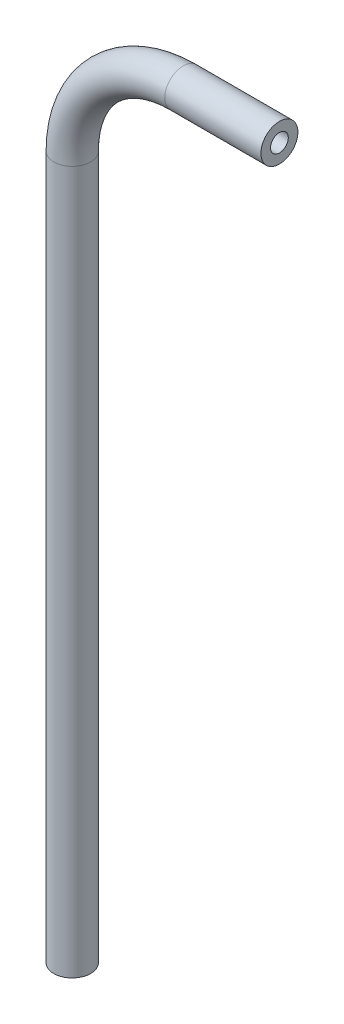
ISO-10303-21;
HEADER;
FILE_DESCRIPTION(('STEP AP214'),'2;1');
FILE_NAME('part.step','',(''),(''),'','','');
FILE_SCHEMA(('AUTOMOTIVE_DESIGN { 1 0 10303 214 1 1 1 1 }'));
ENDSEC;
DATA;
#1=APPLICATION_CONTEXT('core data for automotive mechanical design processes');
#2=APPLICATION_PROTOCOL_DEFINITION('international standard','automotive_design',2000,#1);
#3=PRODUCT_CONTEXT('',#1,'mechanical');
#4=PRODUCT('Part','Part','',(#3));
#5=PRODUCT_RELATED_PRODUCT_CATEGORY('part','',(#4));
#6=PRODUCT_DEFINITION_FORMATION('','',#4);
#7=PRODUCT_DEFINITION_CONTEXT('part definition',#1,'design');
#8=PRODUCT_DEFINITION('design','',#6,#7);
#9=PRODUCT_DEFINITION_SHAPE('','',#8);
#10=(LENGTH_UNIT() NAMED_UNIT(*) SI_UNIT(.MILLI.,.METRE.));
#11=(NAMED_UNIT(*) PLANE_ANGLE_UNIT() SI_UNIT($,.RADIAN.));
#12=(NAMED_UNIT(*) SI_UNIT($,.STERADIAN.) SOLID_ANGLE_UNIT());
#13=UNCERTAINTY_MEASURE_WITH_UNIT(LENGTH_MEASURE(1.E-05),#10,'distance_accuracy_value','');
#14=(GEOMETRIC_REPRESENTATION_CONTEXT(3) GLOBAL_UNCERTAINTY_ASSIGNED_CONTEXT((#13)) GLOBAL_UNIT_ASSIGNED_CONTEXT((#10,
#11,#12)) REPRESENTATION_CONTEXT('',''));
#15=CARTESIAN_POINT('',(0.,0.,0.));
#16=DIRECTION('',(0.,0.,1.));
#17=DIRECTION('',(1.,0.,0.));
#18=AXIS2_PLACEMENT_3D('',#15,#16,#17);
#19=CARTESIAN_POINT('',(0.,-122.172317880795,0.));
#20=DIRECTION('',(0.,1.,0.));
#21=DIRECTION('',(-1.,0.,0.));
#22=AXIS2_PLACEMENT_3D('',#19,#20,#21);
#23=CYLINDRICAL_SURFACE('',#22,3.175);
#24=CARTESIAN_POINT('',(0.,-1.52231788079486,0.));
#25=DIRECTION('',(0.,1.,0.));
#26=DIRECTION('',(-1.,0.,0.));
#27=AXIS2_PLACEMENT_3D('',#24,#25,#26);
#28=CIRCLE('',#27,3.175);
#29=CARTESIAN_POINT('',(-3.175,-1.52231788079489,0.));
#30=VERTEX_POINT('',#29);
#31=EDGE_CURVE('E94',#30,#30,#28,.T.);
#32=ORIENTED_EDGE('',*,*,#31,.F.);
#33=EDGE_LOOP('',(#32));
#34=FACE_BOUND('',#33,.T.);
#35=CARTESIAN_POINT('',(0.,-122.172317880795,0.));
#36=DIRECTION('',(0.,1.,0.));
#37=DIRECTION('',(-1.,0.,0.));
#38=AXIS2_PLACEMENT_3D('',#35,#36,#37);
#39=CIRCLE('',#38,3.175);
#40=CARTESIAN_POINT('',(-3.175,-122.172317880795,0.));
#41=VERTEX_POINT('',#40);
#42=EDGE_CURVE('E59',#41,#41,#39,.T.);
#43=ORIENTED_EDGE('',*,*,#42,.T.);
#44=EDGE_LOOP('',(#43));
#45=FACE_BOUND('',#44,.T.);
#46=ADVANCED_FACE('F43',(#34,#45),#23,.T.);
#47=CARTESIAN_POINT('',(19.05,-1.52231788079469,0.));
#48=DIRECTION('',(0.,0.,-1.));
#49=DIRECTION('',(-1.,0.,0.));
#50=AXIS2_PLACEMENT_3D('',#47,#48,#49);
#51=TOROIDAL_SURFACE('',#50,19.05,3.175);
#52=CARTESIAN_POINT('',(19.0500000000001,17.5276821192053,0.));
#53=DIRECTION('',(1.,0.,0.));
#54=DIRECTION('',(0.,1.,0.));
#55=AXIS2_PLACEMENT_3D('',#52,#53,#54);
#56=CIRCLE('',#55,3.175);
#57=CARTESIAN_POINT('',(19.0500000000001,20.7026821192053,0.));
#58=VERTEX_POINT('',#57);
#59=EDGE_CURVE('E47',#58,#58,#56,.T.);
#60=CARTESIAN_POINT('',(19.05,-1.52231788079469,0.));
#61=DIRECTION('',(0.,0.,-1.));
#62=DIRECTION('',(-1.,0.,0.));
#63=AXIS2_PLACEMENT_3D('',#60,#61,#62);
#64=CIRCLE('',#63,22.225);
#65=EDGE_CURVE('',#30,#58,#64,.T.);
#66=ORIENTED_EDGE('',*,*,#31,.T.);
#67=ORIENTED_EDGE('',*,*,#59,.F.);
#68=ORIENTED_EDGE('',*,*,#65,.T.);
#69=ORIENTED_EDGE('',*,*,#65,.F.);
#70=EDGE_LOOP('',(#66,#68,#67,#69));
#71=FACE_BOUND('',#70,.T.);
#72=ADVANCED_FACE('F104',(#71),#51,.T.);
#73=CARTESIAN_POINT('',(19.0500000000001,17.5276821192053,0.));
#74=DIRECTION('',(1.,0.,0.));
#75=DIRECTION('',(0.,1.,0.));
#76=AXIS2_PLACEMENT_3D('',#73,#74,#75);
#77=CYLINDRICAL_SURFACE('',#76,3.175);
#78=CARTESIAN_POINT('',(35.56,17.5276821192053,0.));
#79=DIRECTION('',(1.,0.,0.));
#80=DIRECTION('',(0.,1.,0.));
#81=AXIS2_PLACEMENT_3D('',#78,#79,#80);
#82=CIRCLE('',#81,3.175);
#83=CARTESIAN_POINT('',(35.56,20.7026821192053,0.));
#84=VERTEX_POINT('',#83);
#85=EDGE_CURVE('E64',#84,#84,#82,.T.);
#86=ORIENTED_EDGE('',*,*,#85,.F.);
#87=EDGE_LOOP('',(#86));
#88=FACE_BOUND('',#87,.T.);
#89=ORIENTED_EDGE('',*,*,#59,.T.);
#90=EDGE_LOOP('',(#89));
#91=FACE_BOUND('',#90,.T.);
#92=ADVANCED_FACE('F45',(#88,#91),#77,.T.);
#93=CARTESIAN_POINT('',(0.,-122.172317880795,0.));
#94=DIRECTION('',(0.,1.,0.));
#95=DIRECTION('',(-1.,0.,0.));
#96=AXIS2_PLACEMENT_3D('',#93,#94,#95);
#97=PLANE('',#96);
#98=CARTESIAN_POINT('',(0.,-122.172317880795,0.));
#99=DIRECTION('',(0.,1.,0.));
#100=DIRECTION('',(-1.,0.,0.));
#101=AXIS2_PLACEMENT_3D('',#98,#99,#100);
#102=CIRCLE('',#101,1.524);
#103=CARTESIAN_POINT('',(-1.524,-122.172317880795,0.));
#104=VERTEX_POINT('',#103);
#105=EDGE_CURVE('E87',#104,#104,#102,.F.);
#106=ORIENTED_EDGE('',*,*,#105,.F.);
#107=EDGE_LOOP('',(#106));
#108=FACE_BOUND('',#107,.T.);
#109=ORIENTED_EDGE('',*,*,#42,.F.);
#110=EDGE_LOOP('',(#109));
#111=FACE_BOUND('',#110,.T.);
#112=ADVANCED_FACE('F110',(#108,#111),#97,.F.);
#113=CARTESIAN_POINT('',(35.56,17.5276821192053,0.));
#114=DIRECTION('',(1.,0.,0.));
#115=DIRECTION('',(0.,1.,0.));
#116=AXIS2_PLACEMENT_3D('',#113,#114,#115);
#117=PLANE('',#116);
#118=CARTESIAN_POINT('',(35.56,17.5276821192053,0.));
#119=DIRECTION('',(1.,0.,0.));
#120=DIRECTION('',(0.,1.,0.));
#121=AXIS2_PLACEMENT_3D('',#118,#119,#120);
#122=CIRCLE('',#121,1.524);
#123=CARTESIAN_POINT('',(35.56,19.0516821192053,0.));
#124=VERTEX_POINT('',#123);
#125=EDGE_CURVE('E11',#124,#124,#122,.F.);
#126=ORIENTED_EDGE('',*,*,#125,.T.);
#127=EDGE_LOOP('',(#126));
#128=FACE_BOUND('',#127,.T.);
#129=ORIENTED_EDGE('',*,*,#85,.T.);
#130=EDGE_LOOP('',(#129));
#131=FACE_BOUND('',#130,.T.);
#132=ADVANCED_FACE('F71',(#128,#131),#117,.T.);
#133=CARTESIAN_POINT('',(0.,-122.172317880795,0.));
#134=DIRECTION('',(0.,1.,0.));
#135=DIRECTION('',(-1.,0.,0.));
#136=AXIS2_PLACEMENT_3D('',#133,#134,#135);
#137=CYLINDRICAL_SURFACE('',#136,1.524);
#138=CARTESIAN_POINT('',(0.,-1.52231788079486,0.));
#139=DIRECTION('',(0.,1.,0.));
#140=DIRECTION('',(-1.,0.,0.));
#141=AXIS2_PLACEMENT_3D('',#138,#139,#140);
#142=CIRCLE('',#141,1.524);
#143=CARTESIAN_POINT('',(-1.524,-1.52231788079488,0.));
#144=VERTEX_POINT('',#143);
#145=EDGE_CURVE('E83',#144,#144,#142,.F.);
#146=ORIENTED_EDGE('',*,*,#145,.F.);
#147=EDGE_LOOP('',(#146));
#148=FACE_BOUND('',#147,.T.);
#149=ORIENTED_EDGE('',*,*,#105,.T.);
#150=EDGE_LOOP('',(#149));
#151=FACE_BOUND('',#150,.T.);
#152=ADVANCED_FACE('F118',(#148,#151),#137,.F.);
#153=CARTESIAN_POINT('',(19.05,-1.52231788079469,0.));
#154=DIRECTION('',(0.,0.,-1.));
#155=DIRECTION('',(-1.,0.,0.));
#156=AXIS2_PLACEMENT_3D('',#153,#154,#155);
#157=TOROIDAL_SURFACE('',#156,19.05,1.524);
#158=CARTESIAN_POINT('',(19.0500000000001,17.5276821192053,0.));
#159=DIRECTION('',(1.,0.,0.));
#160=DIRECTION('',(0.,1.,0.));
#161=AXIS2_PLACEMENT_3D('',#158,#159,#160);
#162=CIRCLE('',#161,1.524);
#163=CARTESIAN_POINT('',(19.0500000000001,19.0516821192053,0.));
#164=VERTEX_POINT('',#163);
#165=EDGE_CURVE('E53',#164,#164,#162,.F.);
#166=CARTESIAN_POINT('',(19.05,-1.52231788079469,0.));
#167=DIRECTION('',(0.,0.,-1.));
#168=DIRECTION('',(-1.,0.,0.));
#169=AXIS2_PLACEMENT_3D('',#166,#167,#168);
#170=CIRCLE('',#169,20.574);
#171=EDGE_CURVE('',#144,#164,#170,.T.);
#172=ORIENTED_EDGE('',*,*,#145,.T.);
#173=ORIENTED_EDGE('',*,*,#165,.F.);
#174=ORIENTED_EDGE('',*,*,#171,.T.);
#175=ORIENTED_EDGE('',*,*,#171,.F.);
#176=EDGE_LOOP('',(#172,#174,#173,#175));
#177=FACE_BOUND('',#176,.T.);
#178=ADVANCED_FACE('F77',(#177),#157,.F.);
#179=CARTESIAN_POINT('',(19.0500000000001,17.5276821192053,0.));
#180=DIRECTION('',(1.,0.,0.));
#181=DIRECTION('',(0.,1.,0.));
#182=AXIS2_PLACEMENT_3D('',#179,#180,#181);
#183=CYLINDRICAL_SURFACE('',#182,1.524);
#184=ORIENTED_EDGE('',*,*,#125,.F.);
#185=EDGE_LOOP('',(#184));
#186=FACE_BOUND('',#185,.T.);
#187=ORIENTED_EDGE('',*,*,#165,.T.);
#188=EDGE_LOOP('',(#187));
#189=FACE_BOUND('',#188,.T.);
#190=ADVANCED_FACE('F74',(#186,#189),#183,.F.);
#191=CLOSED_SHELL('',(#46,#72,#92,#112,#132,#152,#178,#190));
#192=MANIFOLD_SOLID_BREP('B2',#191);
#193=ADVANCED_BREP_SHAPE_REPRESENTATION('',(#18,#192),#14);
#194=SHAPE_DEFINITION_REPRESENTATION(#9,#193);
ENDSEC;
END-ISO-10303-21;
